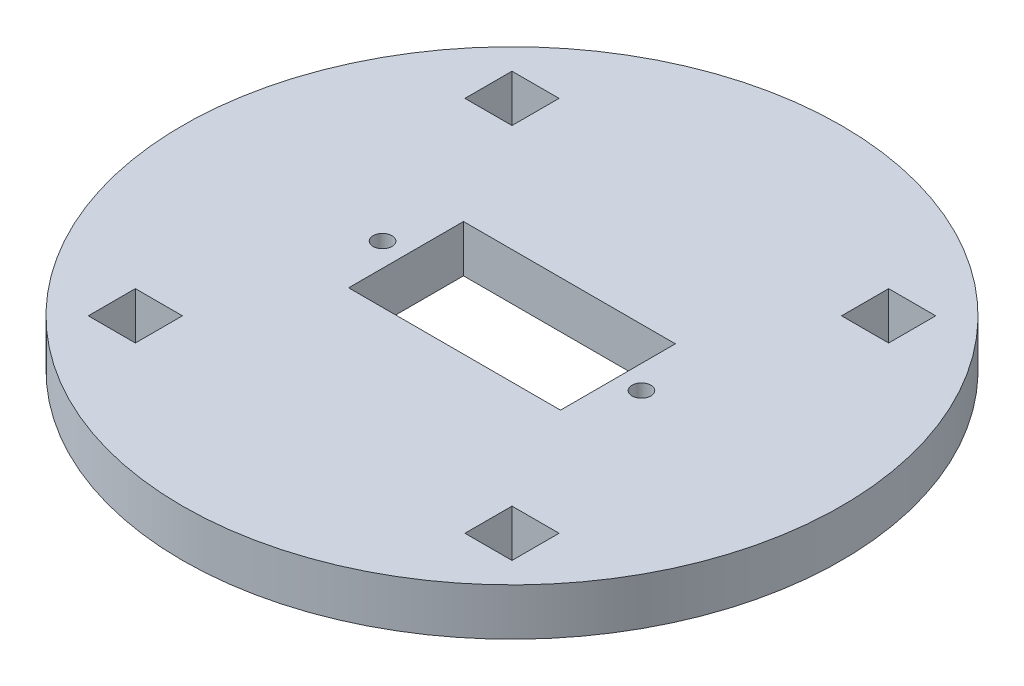
ISO-10303-21;
HEADER;
FILE_DESCRIPTION(('STEP AP214'),'2;1');
FILE_NAME('part.step','',(''),(''),'','','');
FILE_SCHEMA(('AUTOMOTIVE_DESIGN { 1 0 10303 214 1 1 1 1 }'));
ENDSEC;
DATA;
#1=APPLICATION_CONTEXT('core data for automotive mechanical design processes');
#2=APPLICATION_PROTOCOL_DEFINITION('international standard','automotive_design',2000,#1);
#3=PRODUCT_CONTEXT('',#1,'mechanical');
#4=PRODUCT('Part','Part','',(#3));
#5=PRODUCT_RELATED_PRODUCT_CATEGORY('part','',(#4));
#6=PRODUCT_DEFINITION_FORMATION('','',#4);
#7=PRODUCT_DEFINITION_CONTEXT('part definition',#1,'design');
#8=PRODUCT_DEFINITION('design','',#6,#7);
#9=PRODUCT_DEFINITION_SHAPE('','',#8);
#10=(LENGTH_UNIT() NAMED_UNIT(*) SI_UNIT(.MILLI.,.METRE.));
#11=(NAMED_UNIT(*) PLANE_ANGLE_UNIT() SI_UNIT($,.RADIAN.));
#12=(NAMED_UNIT(*) SI_UNIT($,.STERADIAN.) SOLID_ANGLE_UNIT());
#13=UNCERTAINTY_MEASURE_WITH_UNIT(LENGTH_MEASURE(1.E-05),#10,'distance_accuracy_value','');
#14=(GEOMETRIC_REPRESENTATION_CONTEXT(3) GLOBAL_UNCERTAINTY_ASSIGNED_CONTEXT((#13)) GLOBAL_UNIT_ASSIGNED_CONTEXT((#10,
#11,#12)) REPRESENTATION_CONTEXT('',''));
#15=CARTESIAN_POINT('',(0.,0.,0.));
#16=DIRECTION('',(0.,0.,1.));
#17=DIRECTION('',(1.,0.,0.));
#18=AXIS2_PLACEMENT_3D('',#15,#16,#17);
#19=CARTESIAN_POINT('',(0.,5.,0.));
#20=DIRECTION('',(0.,1.,0.));
#21=DIRECTION('',(0.,0.,1.));
#22=AXIS2_PLACEMENT_3D('',#19,#20,#21);
#23=PLANE('',#22);
#24=CARTESIAN_POINT('',(13.75,5.,0.));
#25=DIRECTION('',(0.,1.,0.));
#26=DIRECTION('',(0.,0.,1.));
#27=AXIS2_PLACEMENT_3D('',#24,#25,#26);
#28=CIRCLE('',#27,1.);
#29=CARTESIAN_POINT('',(13.75,5.,0.999999999999994));
#30=VERTEX_POINT('',#29);
#31=EDGE_CURVE('E311',#30,#30,#28,.T.);
#32=ORIENTED_EDGE('',*,*,#31,.F.);
#33=EDGE_LOOP('',(#32));
#34=FACE_BOUND('',#33,.T.);
#35=CARTESIAN_POINT('',(0.,5.,0.));
#36=DIRECTION('',(0.,1.,0.));
#37=DIRECTION('',(0.,0.,1.));
#38=AXIS2_PLACEMENT_3D('',#35,#36,#37);
#39=CIRCLE('',#38,35.);
#40=CARTESIAN_POINT('',(0.,5.,35.));
#41=VERTEX_POINT('',#40);
#42=EDGE_CURVE('E11',#41,#41,#39,.T.);
#43=ORIENTED_EDGE('',*,*,#42,.T.);
#44=EDGE_LOOP('',(#43));
#45=FACE_BOUND('',#44,.T.);
#46=DIRECTION('',(-1.,0.,0.));
#47=VECTOR('',#46,1.);
#48=CARTESIAN_POINT('',(-11.25,5.,-6.1));
#49=LINE('',#48,#47);
#50=CARTESIAN_POINT('',(11.25,5.,-6.1));
#51=VERTEX_POINT('',#50);
#52=CARTESIAN_POINT('',(-11.25,5.,-6.1));
#53=VERTEX_POINT('',#52);
#54=EDGE_CURVE('E319',#51,#53,#49,.T.);
#55=ORIENTED_EDGE('',*,*,#54,.F.);
#56=DIRECTION('',(0.,0.,-1.));
#57=VECTOR('',#56,1.);
#58=CARTESIAN_POINT('',(11.25,5.,6.1));
#59=LINE('',#58,#57);
#60=CARTESIAN_POINT('',(11.25,5.,6.1));
#61=VERTEX_POINT('',#60);
#62=EDGE_CURVE('E317',#61,#51,#59,.T.);
#63=ORIENTED_EDGE('',*,*,#62,.F.);
#64=DIRECTION('',(1.,0.,0.));
#65=VECTOR('',#64,1.);
#66=CARTESIAN_POINT('',(-11.25,5.,6.1));
#67=LINE('',#66,#65);
#68=CARTESIAN_POINT('',(-11.25,5.,6.1));
#69=VERTEX_POINT('',#68);
#70=EDGE_CURVE('E325',#69,#61,#67,.T.);
#71=ORIENTED_EDGE('',*,*,#70,.F.);
#72=DIRECTION('',(0.,0.,1.));
#73=VECTOR('',#72,1.);
#74=CARTESIAN_POINT('',(-11.25,5.,6.1));
#75=LINE('',#74,#73);
#76=EDGE_CURVE('E322',#53,#69,#75,.T.);
#77=ORIENTED_EDGE('',*,*,#76,.F.);
#78=EDGE_LOOP('',(#55,#63,#71,#77));
#79=FACE_BOUND('',#78,.T.);
#80=CARTESIAN_POINT('',(-13.75,5.,0.));
#81=DIRECTION('',(0.,1.,0.));
#82=DIRECTION('',(0.,0.,1.));
#83=AXIS2_PLACEMENT_3D('',#80,#81,#82);
#84=CIRCLE('',#83,1.);
#85=CARTESIAN_POINT('',(-13.75,5.,1.));
#86=VERTEX_POINT('',#85);
#87=EDGE_CURVE('E305',#86,#86,#84,.T.);
#88=ORIENTED_EDGE('',*,*,#87,.F.);
#89=EDGE_LOOP('',(#88));
#90=FACE_BOUND('',#89,.T.);
#91=DIRECTION('',(-1.,0.,0.));
#92=VECTOR('',#91,1.);
#93=CARTESIAN_POINT('',(-22.5,5.,17.5));
#94=LINE('',#93,#92);
#95=CARTESIAN_POINT('',(-17.5,5.,17.5));
#96=VERTEX_POINT('',#95);
#97=CARTESIAN_POINT('',(-22.5,5.,17.5));
#98=VERTEX_POINT('',#97);
#99=EDGE_CURVE('E276',#96,#98,#94,.T.);
#100=ORIENTED_EDGE('',*,*,#99,.F.);
#101=DIRECTION('',(0.,0.,-1.));
#102=VECTOR('',#101,1.);
#103=CARTESIAN_POINT('',(-17.5,5.,17.5));
#104=LINE('',#103,#102);
#105=CARTESIAN_POINT('',(-17.5,5.,22.5));
#106=VERTEX_POINT('',#105);
#107=EDGE_CURVE('E274',#106,#96,#104,.T.);
#108=ORIENTED_EDGE('',*,*,#107,.F.);
#109=DIRECTION('',(1.,0.,0.));
#110=VECTOR('',#109,1.);
#111=CARTESIAN_POINT('',(-22.5,5.,22.5));
#112=LINE('',#111,#110);
#113=CARTESIAN_POINT('',(-22.5,5.,22.5));
#114=VERTEX_POINT('',#113);
#115=EDGE_CURVE('E282',#114,#106,#112,.T.);
#116=ORIENTED_EDGE('',*,*,#115,.F.);
#117=DIRECTION('',(0.,0.,1.));
#118=VECTOR('',#117,1.);
#119=CARTESIAN_POINT('',(-22.5,5.,17.5));
#120=LINE('',#119,#118);
#121=EDGE_CURVE('E279',#98,#114,#120,.T.);
#122=ORIENTED_EDGE('',*,*,#121,.F.);
#123=EDGE_LOOP('',(#100,#108,#116,#122));
#124=FACE_BOUND('',#123,.T.);
#125=DIRECTION('',(1.,0.,0.));
#126=VECTOR('',#125,1.);
#127=CARTESIAN_POINT('',(-17.4999999999999,5.,-17.5000000000001));
#128=LINE('',#127,#126);
#129=CARTESIAN_POINT('',(-22.4999999999999,5.,-17.5000000000001));
#130=VERTEX_POINT('',#129);
#131=CARTESIAN_POINT('',(-17.4999999999999,5.,-17.5000000000001));
#132=VERTEX_POINT('',#131);
#133=EDGE_CURVE('E245',#130,#132,#128,.T.);
#134=ORIENTED_EDGE('',*,*,#133,.F.);
#135=DIRECTION('',(0.,0.,1.));
#136=VECTOR('',#135,1.);
#137=CARTESIAN_POINT('',(-22.4999999999999,5.,-22.5000000000001));
#138=LINE('',#137,#136);
#139=CARTESIAN_POINT('',(-22.4999999999999,5.,-22.5000000000001));
#140=VERTEX_POINT('',#139);
#141=EDGE_CURVE('E243',#140,#130,#138,.T.);
#142=ORIENTED_EDGE('',*,*,#141,.F.);
#143=DIRECTION('',(-1.,0.,0.));
#144=VECTOR('',#143,1.);
#145=CARTESIAN_POINT('',(-17.4999999999999,5.,-22.5000000000001));
#146=LINE('',#145,#144);
#147=CARTESIAN_POINT('',(-17.4999999999999,5.,-22.5000000000001));
#148=VERTEX_POINT('',#147);
#149=EDGE_CURVE('E251',#148,#140,#146,.T.);
#150=ORIENTED_EDGE('',*,*,#149,.F.);
#151=DIRECTION('',(0.,0.,-1.));
#152=VECTOR('',#151,1.);
#153=CARTESIAN_POINT('',(-17.4999999999999,5.,-22.5000000000001));
#154=LINE('',#153,#152);
#155=EDGE_CURVE('E248',#132,#148,#154,.T.);
#156=ORIENTED_EDGE('',*,*,#155,.F.);
#157=EDGE_LOOP('',(#134,#142,#150,#156));
#158=FACE_BOUND('',#157,.T.);
#159=DIRECTION('',(0.,0.,1.));
#160=VECTOR('',#159,1.);
#161=CARTESIAN_POINT('',(17.5000000000001,5.,-17.4999999999999));
#162=LINE('',#161,#160);
#163=CARTESIAN_POINT('',(17.5000000000001,5.,-22.4999999999999));
#164=VERTEX_POINT('',#163);
#165=CARTESIAN_POINT('',(17.5000000000001,5.,-17.4999999999999));
#166=VERTEX_POINT('',#165);
#167=EDGE_CURVE('E214',#164,#166,#162,.T.);
#168=ORIENTED_EDGE('',*,*,#167,.F.);
#169=DIRECTION('',(-1.,0.,0.));
#170=VECTOR('',#169,1.);
#171=CARTESIAN_POINT('',(22.5000000000002,5.,-22.4999999999999));
#172=LINE('',#171,#170);
#173=CARTESIAN_POINT('',(22.5000000000002,5.,-22.4999999999999));
#174=VERTEX_POINT('',#173);
#175=EDGE_CURVE('E212',#174,#164,#172,.T.);
#176=ORIENTED_EDGE('',*,*,#175,.F.);
#177=DIRECTION('',(0.,0.,-1.));
#178=VECTOR('',#177,1.);
#179=CARTESIAN_POINT('',(22.5000000000001,5.,-17.4999999999999));
#180=LINE('',#179,#178);
#181=CARTESIAN_POINT('',(22.5000000000001,5.,-17.4999999999999));
#182=VERTEX_POINT('',#181);
#183=EDGE_CURVE('E220',#182,#174,#180,.T.);
#184=ORIENTED_EDGE('',*,*,#183,.F.);
#185=DIRECTION('',(1.,0.,0.));
#186=VECTOR('',#185,1.);
#187=CARTESIAN_POINT('',(22.5000000000001,5.,-17.4999999999999));
#188=LINE('',#187,#186);
#189=EDGE_CURVE('E217',#166,#182,#188,.T.);
#190=ORIENTED_EDGE('',*,*,#189,.F.);
#191=EDGE_LOOP('',(#168,#176,#184,#190));
#192=FACE_BOUND('',#191,.T.);
#193=DIRECTION('',(-1.,0.,0.));
#194=VECTOR('',#193,1.);
#195=CARTESIAN_POINT('',(17.4999999999998,5.,17.5000000000002));
#196=LINE('',#195,#194);
#197=CARTESIAN_POINT('',(22.4999999999998,5.,17.5000000000002));
#198=VERTEX_POINT('',#197);
#199=CARTESIAN_POINT('',(17.4999999999998,5.,17.5000000000002));
#200=VERTEX_POINT('',#199);
#201=EDGE_CURVE('E184',#198,#200,#196,.T.);
#202=ORIENTED_EDGE('',*,*,#201,.F.);
#203=DIRECTION('',(0.,0.,-1.));
#204=VECTOR('',#203,1.);
#205=CARTESIAN_POINT('',(22.4999999999998,5.,22.5000000000002));
#206=LINE('',#205,#204);
#207=CARTESIAN_POINT('',(22.4999999999998,5.,22.5000000000002));
#208=VERTEX_POINT('',#207);
#209=EDGE_CURVE('E176',#208,#198,#206,.T.);
#210=ORIENTED_EDGE('',*,*,#209,.F.);
#211=DIRECTION('',(1.,0.,0.));
#212=VECTOR('',#211,1.);
#213=CARTESIAN_POINT('',(17.4999999999998,5.,22.5000000000002));
#214=LINE('',#213,#212);
#215=CARTESIAN_POINT('',(17.4999999999998,5.,22.5000000000002));
#216=VERTEX_POINT('',#215);
#217=EDGE_CURVE('E198',#216,#208,#214,.T.);
#218=ORIENTED_EDGE('',*,*,#217,.F.);
#219=DIRECTION('',(0.,0.,1.));
#220=VECTOR('',#219,1.);
#221=CARTESIAN_POINT('',(17.4999999999998,5.,22.5000000000002));
#222=LINE('',#221,#220);
#223=EDGE_CURVE('E196',#200,#216,#222,.T.);
#224=ORIENTED_EDGE('',*,*,#223,.F.);
#225=EDGE_LOOP('',(#202,#210,#218,#224));
#226=FACE_BOUND('',#225,.T.);
#227=ADVANCED_FACE('F39',(#34,#45,#79,#90,#124,#158,#192,#226),#23,.T.);
#228=CARTESIAN_POINT('',(0.,0.,0.));
#229=DIRECTION('',(0.,1.,0.));
#230=DIRECTION('',(0.,0.,1.));
#231=AXIS2_PLACEMENT_3D('',#228,#229,#230);
#232=PLANE('',#231);
#233=DIRECTION('',(-1.,0.,0.));
#234=VECTOR('',#233,1.);
#235=CARTESIAN_POINT('',(22.5000000000002,0.,-22.4999999999999));
#236=LINE('',#235,#234);
#237=CARTESIAN_POINT('',(22.5000000000002,0.,-22.4999999999999));
#238=VERTEX_POINT('',#237);
#239=CARTESIAN_POINT('',(17.5000000000001,0.,-22.4999999999999));
#240=VERTEX_POINT('',#239);
#241=EDGE_CURVE('E192',#238,#240,#236,.T.);
#242=ORIENTED_EDGE('',*,*,#241,.T.);
#243=DIRECTION('',(0.,0.,1.));
#244=VECTOR('',#243,1.);
#245=CARTESIAN_POINT('',(17.5000000000001,0.,-17.4999999999999));
#246=LINE('',#245,#244);
#247=CARTESIAN_POINT('',(17.5000000000001,0.,-17.4999999999999));
#248=VERTEX_POINT('',#247);
#249=EDGE_CURVE('E225',#240,#248,#246,.T.);
#250=ORIENTED_EDGE('',*,*,#249,.T.);
#251=DIRECTION('',(1.,0.,0.));
#252=VECTOR('',#251,1.);
#253=CARTESIAN_POINT('',(22.5000000000001,0.,-17.4999999999999));
#254=LINE('',#253,#252);
#255=CARTESIAN_POINT('',(22.5000000000001,0.,-17.4999999999999));
#256=VERTEX_POINT('',#255);
#257=EDGE_CURVE('E228',#248,#256,#254,.T.);
#258=ORIENTED_EDGE('',*,*,#257,.T.);
#259=DIRECTION('',(0.,0.,-1.));
#260=VECTOR('',#259,1.);
#261=CARTESIAN_POINT('',(22.5000000000001,0.,-17.4999999999999));
#262=LINE('',#261,#260);
#263=EDGE_CURVE('E215',#256,#238,#262,.T.);
#264=ORIENTED_EDGE('',*,*,#263,.T.);
#265=EDGE_LOOP('',(#242,#250,#258,#264));
#266=FACE_BOUND('',#265,.T.);
#267=DIRECTION('',(0.,0.,-1.));
#268=VECTOR('',#267,1.);
#269=CARTESIAN_POINT('',(-17.5,0.,17.5));
#270=LINE('',#269,#268);
#271=CARTESIAN_POINT('',(-17.5,0.,22.5));
#272=VERTEX_POINT('',#271);
#273=CARTESIAN_POINT('',(-17.5,0.,17.5));
#274=VERTEX_POINT('',#273);
#275=EDGE_CURVE('E273',#272,#274,#270,.T.);
#276=ORIENTED_EDGE('',*,*,#275,.T.);
#277=DIRECTION('',(-1.,0.,0.));
#278=VECTOR('',#277,1.);
#279=CARTESIAN_POINT('',(-22.5,0.,17.5));
#280=LINE('',#279,#278);
#281=CARTESIAN_POINT('',(-22.5,0.,17.5));
#282=VERTEX_POINT('',#281);
#283=EDGE_CURVE('E287',#274,#282,#280,.T.);
#284=ORIENTED_EDGE('',*,*,#283,.T.);
#285=DIRECTION('',(0.,0.,1.));
#286=VECTOR('',#285,1.);
#287=CARTESIAN_POINT('',(-22.5,0.,17.5));
#288=LINE('',#287,#286);
#289=CARTESIAN_POINT('',(-22.5,0.,22.5));
#290=VERTEX_POINT('',#289);
#291=EDGE_CURVE('E290',#282,#290,#288,.T.);
#292=ORIENTED_EDGE('',*,*,#291,.T.);
#293=DIRECTION('',(1.,0.,0.));
#294=VECTOR('',#293,1.);
#295=CARTESIAN_POINT('',(-22.5,0.,22.5));
#296=LINE('',#295,#294);
#297=EDGE_CURVE('E277',#290,#272,#296,.T.);
#298=ORIENTED_EDGE('',*,*,#297,.T.);
#299=EDGE_LOOP('',(#276,#284,#292,#298));
#300=FACE_BOUND('',#299,.T.);
#301=CARTESIAN_POINT('',(0.,0.,0.));
#302=DIRECTION('',(0.,1.,0.));
#303=DIRECTION('',(0.,0.,1.));
#304=AXIS2_PLACEMENT_3D('',#301,#302,#303);
#305=CIRCLE('',#304,35.);
#306=CARTESIAN_POINT('',(0.,0.,35.));
#307=VERTEX_POINT('',#306);
#308=EDGE_CURVE('E43',#307,#307,#305,.T.);
#309=ORIENTED_EDGE('',*,*,#308,.F.);
#310=EDGE_LOOP('',(#309));
#311=FACE_BOUND('',#310,.T.);
#312=DIRECTION('',(0.,0.,-1.));
#313=VECTOR('',#312,1.);
#314=CARTESIAN_POINT('',(11.25,0.,6.1));
#315=LINE('',#314,#313);
#316=CARTESIAN_POINT('',(11.25,0.,6.1));
#317=VERTEX_POINT('',#316);
#318=CARTESIAN_POINT('',(11.25,0.,-6.1));
#319=VERTEX_POINT('',#318);
#320=EDGE_CURVE('E314',#317,#319,#315,.T.);
#321=ORIENTED_EDGE('',*,*,#320,.T.);
#322=DIRECTION('',(-1.,0.,0.));
#323=VECTOR('',#322,1.);
#324=CARTESIAN_POINT('',(-11.25,0.,-6.1));
#325=LINE('',#324,#323);
#326=CARTESIAN_POINT('',(-11.25,0.,-6.1));
#327=VERTEX_POINT('',#326);
#328=EDGE_CURVE('E330',#319,#327,#325,.T.);
#329=ORIENTED_EDGE('',*,*,#328,.T.);
#330=DIRECTION('',(0.,0.,1.));
#331=VECTOR('',#330,1.);
#332=CARTESIAN_POINT('',(-11.25,0.,6.1));
#333=LINE('',#332,#331);
#334=CARTESIAN_POINT('',(-11.25,0.,6.1));
#335=VERTEX_POINT('',#334);
#336=EDGE_CURVE('E333',#327,#335,#333,.T.);
#337=ORIENTED_EDGE('',*,*,#336,.T.);
#338=DIRECTION('',(1.,0.,0.));
#339=VECTOR('',#338,1.);
#340=CARTESIAN_POINT('',(-11.25,0.,6.1));
#341=LINE('',#340,#339);
#342=EDGE_CURVE('E320',#335,#317,#341,.T.);
#343=ORIENTED_EDGE('',*,*,#342,.T.);
#344=EDGE_LOOP('',(#321,#329,#337,#343));
#345=FACE_BOUND('',#344,.T.);
#346=CARTESIAN_POINT('',(13.75,0.,0.));
#347=DIRECTION('',(0.,1.,0.));
#348=DIRECTION('',(0.,0.,1.));
#349=AXIS2_PLACEMENT_3D('',#346,#347,#348);
#350=CIRCLE('',#349,1.);
#351=CARTESIAN_POINT('',(13.75,0.,0.999999999999994));
#352=VERTEX_POINT('',#351);
#353=EDGE_CURVE('E308',#352,#352,#350,.T.);
#354=ORIENTED_EDGE('',*,*,#353,.T.);
#355=EDGE_LOOP('',(#354));
#356=FACE_BOUND('',#355,.T.);
#357=CARTESIAN_POINT('',(-13.75,0.,0.));
#358=DIRECTION('',(0.,1.,0.));
#359=DIRECTION('',(0.,0.,1.));
#360=AXIS2_PLACEMENT_3D('',#357,#358,#359);
#361=CIRCLE('',#360,1.);
#362=CARTESIAN_POINT('',(-13.75,0.,1.));
#363=VERTEX_POINT('',#362);
#364=EDGE_CURVE('E304',#363,#363,#361,.T.);
#365=ORIENTED_EDGE('',*,*,#364,.T.);
#366=EDGE_LOOP('',(#365));
#367=FACE_BOUND('',#366,.T.);
#368=DIRECTION('',(0.,0.,1.));
#369=VECTOR('',#368,1.);
#370=CARTESIAN_POINT('',(-22.4999999999999,0.,-22.5000000000001));
#371=LINE('',#370,#369);
#372=CARTESIAN_POINT('',(-22.4999999999999,0.,-22.5000000000001));
#373=VERTEX_POINT('',#372);
#374=CARTESIAN_POINT('',(-22.4999999999999,0.,-17.5000000000001));
#375=VERTEX_POINT('',#374);
#376=EDGE_CURVE('E242',#373,#375,#371,.T.);
#377=ORIENTED_EDGE('',*,*,#376,.T.);
#378=DIRECTION('',(1.,0.,0.));
#379=VECTOR('',#378,1.);
#380=CARTESIAN_POINT('',(-17.4999999999999,0.,-17.5000000000001));
#381=LINE('',#380,#379);
#382=CARTESIAN_POINT('',(-17.4999999999999,0.,-17.5000000000001));
#383=VERTEX_POINT('',#382);
#384=EDGE_CURVE('E256',#375,#383,#381,.T.);
#385=ORIENTED_EDGE('',*,*,#384,.T.);
#386=DIRECTION('',(0.,0.,-1.));
#387=VECTOR('',#386,1.);
#388=CARTESIAN_POINT('',(-17.4999999999999,0.,-22.5000000000001));
#389=LINE('',#388,#387);
#390=CARTESIAN_POINT('',(-17.4999999999999,0.,-22.5000000000001));
#391=VERTEX_POINT('',#390);
#392=EDGE_CURVE('E259',#383,#391,#389,.T.);
#393=ORIENTED_EDGE('',*,*,#392,.T.);
#394=DIRECTION('',(-1.,0.,0.));
#395=VECTOR('',#394,1.);
#396=CARTESIAN_POINT('',(-17.4999999999999,0.,-22.5000000000001));
#397=LINE('',#396,#395);
#398=EDGE_CURVE('E246',#391,#373,#397,.T.);
#399=ORIENTED_EDGE('',*,*,#398,.T.);
#400=EDGE_LOOP('',(#377,#385,#393,#399));
#401=FACE_BOUND('',#400,.T.);
#402=DIRECTION('',(0.,0.,-1.));
#403=VECTOR('',#402,1.);
#404=CARTESIAN_POINT('',(22.4999999999998,0.,22.5000000000002));
#405=LINE('',#404,#403);
#406=CARTESIAN_POINT('',(22.4999999999998,0.,22.5000000000002));
#407=VERTEX_POINT('',#406);
#408=CARTESIAN_POINT('',(22.4999999999998,0.,17.5000000000002));
#409=VERTEX_POINT('',#408);
#410=EDGE_CURVE('E62',#407,#409,#405,.T.);
#411=ORIENTED_EDGE('',*,*,#410,.T.);
#412=DIRECTION('',(-1.,0.,0.));
#413=VECTOR('',#412,1.);
#414=CARTESIAN_POINT('',(17.4999999999998,0.,17.5000000000002));
#415=LINE('',#414,#413);
#416=CARTESIAN_POINT('',(17.4999999999998,0.,17.5000000000002));
#417=VERTEX_POINT('',#416);
#418=EDGE_CURVE('E191',#409,#417,#415,.T.);
#419=ORIENTED_EDGE('',*,*,#418,.T.);
#420=DIRECTION('',(0.,0.,1.));
#421=VECTOR('',#420,1.);
#422=CARTESIAN_POINT('',(17.4999999999998,0.,22.5000000000002));
#423=LINE('',#422,#421);
#424=CARTESIAN_POINT('',(17.4999999999998,0.,22.5000000000002));
#425=VERTEX_POINT('',#424);
#426=EDGE_CURVE('E204',#417,#425,#423,.T.);
#427=ORIENTED_EDGE('',*,*,#426,.T.);
#428=DIRECTION('',(1.,0.,0.));
#429=VECTOR('',#428,1.);
#430=CARTESIAN_POINT('',(17.4999999999998,0.,22.5000000000002));
#431=LINE('',#430,#429);
#432=EDGE_CURVE('E185',#425,#407,#431,.T.);
#433=ORIENTED_EDGE('',*,*,#432,.T.);
#434=EDGE_LOOP('',(#411,#419,#427,#433));
#435=FACE_BOUND('',#434,.T.);
#436=ADVANCED_FACE('F352',(#266,#300,#311,#345,#356,#367,#401,#435),#232,.F.);
#437=CARTESIAN_POINT('',(0.,5.,0.));
#438=DIRECTION('',(0.,-1.,0.));
#439=DIRECTION('',(0.,0.,-1.));
#440=AXIS2_PLACEMENT_3D('',#437,#438,#439);
#441=CYLINDRICAL_SURFACE('',#440,35.);
#442=ORIENTED_EDGE('',*,*,#42,.F.);
#443=EDGE_LOOP('',(#442));
#444=FACE_BOUND('',#443,.T.);
#445=ORIENTED_EDGE('',*,*,#308,.T.);
#446=EDGE_LOOP('',(#445));
#447=FACE_BOUND('',#446,.T.);
#448=ADVANCED_FACE('F41',(#444,#447),#441,.T.);
#449=CARTESIAN_POINT('',(11.25,5.,6.1));
#450=DIRECTION('',(-1.,0.,0.));
#451=DIRECTION('',(0.,0.,1.));
#452=AXIS2_PLACEMENT_3D('',#449,#450,#451);
#453=PLANE('',#452);
#454=ORIENTED_EDGE('',*,*,#320,.F.);
#455=DIRECTION('',(0.,-1.,0.));
#456=VECTOR('',#455,1.);
#457=CARTESIAN_POINT('',(11.25,5.,6.1));
#458=LINE('',#457,#456);
#459=EDGE_CURVE('E327',#61,#317,#458,.T.);
#460=ORIENTED_EDGE('',*,*,#459,.F.);
#461=ORIENTED_EDGE('',*,*,#62,.T.);
#462=DIRECTION('',(0.,-1.,0.));
#463=VECTOR('',#462,1.);
#464=CARTESIAN_POINT('',(11.25,5.,-6.1));
#465=LINE('',#464,#463);
#466=EDGE_CURVE('E344',#51,#319,#465,.T.);
#467=ORIENTED_EDGE('',*,*,#466,.T.);
#468=EDGE_LOOP('',(#454,#460,#461,#467));
#469=FACE_BOUND('',#468,.T.);
#470=ADVANCED_FACE('F380',(#469),#453,.T.);
#471=CARTESIAN_POINT('',(-11.25,5.,-6.1));
#472=DIRECTION('',(0.,0.,1.));
#473=DIRECTION('',(1.,0.,0.));
#474=AXIS2_PLACEMENT_3D('',#471,#472,#473);
#475=PLANE('',#474);
#476=ORIENTED_EDGE('',*,*,#328,.F.);
#477=ORIENTED_EDGE('',*,*,#466,.F.);
#478=ORIENTED_EDGE('',*,*,#54,.T.);
#479=DIRECTION('',(0.,-1.,0.));
#480=VECTOR('',#479,1.);
#481=CARTESIAN_POINT('',(-11.25,5.,-6.1));
#482=LINE('',#481,#480);
#483=EDGE_CURVE('E342',#53,#327,#482,.T.);
#484=ORIENTED_EDGE('',*,*,#483,.T.);
#485=EDGE_LOOP('',(#476,#477,#478,#484));
#486=FACE_BOUND('',#485,.T.);
#487=ADVANCED_FACE('F383',(#486),#475,.T.);
#488=CARTESIAN_POINT('',(-11.25,5.,6.1));
#489=DIRECTION('',(1.,0.,0.));
#490=DIRECTION('',(0.,0.,-1.));
#491=AXIS2_PLACEMENT_3D('',#488,#489,#490);
#492=PLANE('',#491);
#493=ORIENTED_EDGE('',*,*,#336,.F.);
#494=ORIENTED_EDGE('',*,*,#483,.F.);
#495=ORIENTED_EDGE('',*,*,#76,.T.);
#496=DIRECTION('',(0.,-1.,0.));
#497=VECTOR('',#496,1.);
#498=CARTESIAN_POINT('',(-11.25,5.,6.1));
#499=LINE('',#498,#497);
#500=EDGE_CURVE('E340',#69,#335,#499,.T.);
#501=ORIENTED_EDGE('',*,*,#500,.T.);
#502=EDGE_LOOP('',(#493,#494,#495,#501));
#503=FACE_BOUND('',#502,.T.);
#504=ADVANCED_FACE('F386',(#503),#492,.T.);
#505=CARTESIAN_POINT('',(-11.25,5.,6.1));
#506=DIRECTION('',(0.,0.,-1.));
#507=DIRECTION('',(-1.,0.,0.));
#508=AXIS2_PLACEMENT_3D('',#505,#506,#507);
#509=PLANE('',#508);
#510=ORIENTED_EDGE('',*,*,#342,.F.);
#511=ORIENTED_EDGE('',*,*,#500,.F.);
#512=ORIENTED_EDGE('',*,*,#70,.T.);
#513=ORIENTED_EDGE('',*,*,#459,.T.);
#514=EDGE_LOOP('',(#510,#511,#512,#513));
#515=FACE_BOUND('',#514,.T.);
#516=ADVANCED_FACE('F390',(#515),#509,.T.);
#517=CARTESIAN_POINT('',(13.75,5.,0.));
#518=DIRECTION('',(0.,-1.,0.));
#519=DIRECTION('',(0.,0.,-1.));
#520=AXIS2_PLACEMENT_3D('',#517,#518,#519);
#521=CYLINDRICAL_SURFACE('',#520,1.);
#522=ORIENTED_EDGE('',*,*,#31,.T.);
#523=EDGE_LOOP('',(#522));
#524=FACE_BOUND('',#523,.T.);
#525=ORIENTED_EDGE('',*,*,#353,.F.);
#526=EDGE_LOOP('',(#525));
#527=FACE_BOUND('',#526,.T.);
#528=ADVANCED_FACE('F394',(#524,#527),#521,.F.);
#529=CARTESIAN_POINT('',(-13.75,5.,0.));
#530=DIRECTION('',(0.,-1.,0.));
#531=DIRECTION('',(0.,0.,-1.));
#532=AXIS2_PLACEMENT_3D('',#529,#530,#531);
#533=CYLINDRICAL_SURFACE('',#532,1.);
#534=ORIENTED_EDGE('',*,*,#87,.T.);
#535=EDGE_LOOP('',(#534));
#536=FACE_BOUND('',#535,.T.);
#537=ORIENTED_EDGE('',*,*,#364,.F.);
#538=EDGE_LOOP('',(#537));
#539=FACE_BOUND('',#538,.T.);
#540=ADVANCED_FACE('F398',(#536,#539),#533,.F.);
#541=CARTESIAN_POINT('',(-17.5,5.,17.5));
#542=DIRECTION('',(-1.,0.,0.));
#543=DIRECTION('',(0.,0.,1.));
#544=AXIS2_PLACEMENT_3D('',#541,#542,#543);
#545=PLANE('',#544);
#546=ORIENTED_EDGE('',*,*,#275,.F.);
#547=DIRECTION('',(0.,-1.,0.));
#548=VECTOR('',#547,1.);
#549=CARTESIAN_POINT('',(-17.5,5.,22.5));
#550=LINE('',#549,#548);
#551=EDGE_CURVE('E284',#106,#272,#550,.T.);
#552=ORIENTED_EDGE('',*,*,#551,.F.);
#553=ORIENTED_EDGE('',*,*,#107,.T.);
#554=DIRECTION('',(0.,-1.,0.));
#555=VECTOR('',#554,1.);
#556=CARTESIAN_POINT('',(-17.5,5.,17.5));
#557=LINE('',#556,#555);
#558=EDGE_CURVE('E301',#96,#274,#557,.T.);
#559=ORIENTED_EDGE('',*,*,#558,.T.);
#560=EDGE_LOOP('',(#546,#552,#553,#559));
#561=FACE_BOUND('',#560,.T.);
#562=ADVANCED_FACE('F402',(#561),#545,.T.);
#563=CARTESIAN_POINT('',(-22.5,5.,17.5));
#564=DIRECTION('',(0.,0.,1.));
#565=DIRECTION('',(1.,0.,0.));
#566=AXIS2_PLACEMENT_3D('',#563,#564,#565);
#567=PLANE('',#566);
#568=ORIENTED_EDGE('',*,*,#283,.F.);
#569=ORIENTED_EDGE('',*,*,#558,.F.);
#570=ORIENTED_EDGE('',*,*,#99,.T.);
#571=DIRECTION('',(0.,-1.,0.));
#572=VECTOR('',#571,1.);
#573=CARTESIAN_POINT('',(-22.5,5.,17.5));
#574=LINE('',#573,#572);
#575=EDGE_CURVE('E299',#98,#282,#574,.T.);
#576=ORIENTED_EDGE('',*,*,#575,.T.);
#577=EDGE_LOOP('',(#568,#569,#570,#576));
#578=FACE_BOUND('',#577,.T.);
#579=ADVANCED_FACE('F406',(#578),#567,.T.);
#580=CARTESIAN_POINT('',(-22.5,5.,17.5));
#581=DIRECTION('',(1.,0.,0.));
#582=DIRECTION('',(0.,0.,-1.));
#583=AXIS2_PLACEMENT_3D('',#580,#581,#582);
#584=PLANE('',#583);
#585=ORIENTED_EDGE('',*,*,#291,.F.);
#586=ORIENTED_EDGE('',*,*,#575,.F.);
#587=ORIENTED_EDGE('',*,*,#121,.T.);
#588=DIRECTION('',(0.,-1.,0.));
#589=VECTOR('',#588,1.);
#590=CARTESIAN_POINT('',(-22.5,5.,22.5));
#591=LINE('',#590,#589);
#592=EDGE_CURVE('E297',#114,#290,#591,.T.);
#593=ORIENTED_EDGE('',*,*,#592,.T.);
#594=EDGE_LOOP('',(#585,#586,#587,#593));
#595=FACE_BOUND('',#594,.T.);
#596=ADVANCED_FACE('F410',(#595),#584,.T.);
#597=CARTESIAN_POINT('',(-22.5,5.,22.5));
#598=DIRECTION('',(0.,0.,-1.));
#599=DIRECTION('',(-1.,0.,0.));
#600=AXIS2_PLACEMENT_3D('',#597,#598,#599);
#601=PLANE('',#600);
#602=ORIENTED_EDGE('',*,*,#297,.F.);
#603=ORIENTED_EDGE('',*,*,#592,.F.);
#604=ORIENTED_EDGE('',*,*,#115,.T.);
#605=ORIENTED_EDGE('',*,*,#551,.T.);
#606=EDGE_LOOP('',(#602,#603,#604,#605));
#607=FACE_BOUND('',#606,.T.);
#608=ADVANCED_FACE('F414',(#607),#601,.T.);
#609=CARTESIAN_POINT('',(-22.4999999999999,5.,-22.5000000000001));
#610=DIRECTION('',(1.,0.,0.));
#611=DIRECTION('',(0.,0.,-1.));
#612=AXIS2_PLACEMENT_3D('',#609,#610,#611);
#613=PLANE('',#612);
#614=ORIENTED_EDGE('',*,*,#376,.F.);
#615=DIRECTION('',(0.,-1.,0.));
#616=VECTOR('',#615,1.);
#617=CARTESIAN_POINT('',(-22.4999999999999,5.,-22.5000000000001));
#618=LINE('',#617,#616);
#619=EDGE_CURVE('E253',#140,#373,#618,.T.);
#620=ORIENTED_EDGE('',*,*,#619,.F.);
#621=ORIENTED_EDGE('',*,*,#141,.T.);
#622=DIRECTION('',(0.,-1.,0.));
#623=VECTOR('',#622,1.);
#624=CARTESIAN_POINT('',(-22.4999999999999,5.,-17.5000000000001));
#625=LINE('',#624,#623);
#626=EDGE_CURVE('E270',#130,#375,#625,.T.);
#627=ORIENTED_EDGE('',*,*,#626,.T.);
#628=EDGE_LOOP('',(#614,#620,#621,#627));
#629=FACE_BOUND('',#628,.T.);
#630=ADVANCED_FACE('F418',(#629),#613,.T.);
#631=CARTESIAN_POINT('',(-17.4999999999999,5.,-17.5000000000001));
#632=DIRECTION('',(0.,0.,-1.));
#633=DIRECTION('',(-1.,0.,0.));
#634=AXIS2_PLACEMENT_3D('',#631,#632,#633);
#635=PLANE('',#634);
#636=ORIENTED_EDGE('',*,*,#384,.F.);
#637=ORIENTED_EDGE('',*,*,#626,.F.);
#638=ORIENTED_EDGE('',*,*,#133,.T.);
#639=DIRECTION('',(0.,-1.,0.));
#640=VECTOR('',#639,1.);
#641=CARTESIAN_POINT('',(-17.4999999999999,5.,-17.5000000000001));
#642=LINE('',#641,#640);
#643=EDGE_CURVE('E268',#132,#383,#642,.T.);
#644=ORIENTED_EDGE('',*,*,#643,.T.);
#645=EDGE_LOOP('',(#636,#637,#638,#644));
#646=FACE_BOUND('',#645,.T.);
#647=ADVANCED_FACE('F422',(#646),#635,.T.);
#648=CARTESIAN_POINT('',(-17.4999999999999,5.,-22.5000000000001));
#649=DIRECTION('',(-1.,0.,0.));
#650=DIRECTION('',(0.,0.,1.));
#651=AXIS2_PLACEMENT_3D('',#648,#649,#650);
#652=PLANE('',#651);
#653=ORIENTED_EDGE('',*,*,#392,.F.);
#654=ORIENTED_EDGE('',*,*,#643,.F.);
#655=ORIENTED_EDGE('',*,*,#155,.T.);
#656=DIRECTION('',(0.,-1.,0.));
#657=VECTOR('',#656,1.);
#658=CARTESIAN_POINT('',(-17.4999999999999,5.,-22.5000000000001));
#659=LINE('',#658,#657);
#660=EDGE_CURVE('E266',#148,#391,#659,.T.);
#661=ORIENTED_EDGE('',*,*,#660,.T.);
#662=EDGE_LOOP('',(#653,#654,#655,#661));
#663=FACE_BOUND('',#662,.T.);
#664=ADVANCED_FACE('F426',(#663),#652,.T.);
#665=CARTESIAN_POINT('',(-17.4999999999999,5.,-22.5000000000001));
#666=DIRECTION('',(0.,0.,1.));
#667=DIRECTION('',(1.,0.,0.));
#668=AXIS2_PLACEMENT_3D('',#665,#666,#667);
#669=PLANE('',#668);
#670=ORIENTED_EDGE('',*,*,#398,.F.);
#671=ORIENTED_EDGE('',*,*,#660,.F.);
#672=ORIENTED_EDGE('',*,*,#149,.T.);
#673=ORIENTED_EDGE('',*,*,#619,.T.);
#674=EDGE_LOOP('',(#670,#671,#672,#673));
#675=FACE_BOUND('',#674,.T.);
#676=ADVANCED_FACE('F430',(#675),#669,.T.);
#677=CARTESIAN_POINT('',(22.5000000000002,5.,-22.4999999999999));
#678=DIRECTION('',(0.,0.,1.));
#679=DIRECTION('',(1.,0.,0.));
#680=AXIS2_PLACEMENT_3D('',#677,#678,#679);
#681=PLANE('',#680);
#682=ORIENTED_EDGE('',*,*,#241,.F.);
#683=DIRECTION('',(0.,-1.,0.));
#684=VECTOR('',#683,1.);
#685=CARTESIAN_POINT('',(22.5000000000002,5.,-22.4999999999999));
#686=LINE('',#685,#684);
#687=EDGE_CURVE('E222',#174,#238,#686,.T.);
#688=ORIENTED_EDGE('',*,*,#687,.F.);
#689=ORIENTED_EDGE('',*,*,#175,.T.);
#690=DIRECTION('',(0.,-1.,0.));
#691=VECTOR('',#690,1.);
#692=CARTESIAN_POINT('',(17.5000000000001,5.,-22.4999999999999));
#693=LINE('',#692,#691);
#694=EDGE_CURVE('E239',#164,#240,#693,.T.);
#695=ORIENTED_EDGE('',*,*,#694,.T.);
#696=EDGE_LOOP('',(#682,#688,#689,#695));
#697=FACE_BOUND('',#696,.T.);
#698=ADVANCED_FACE('F434',(#697),#681,.T.);
#699=CARTESIAN_POINT('',(17.5000000000001,5.,-17.4999999999999));
#700=DIRECTION('',(1.,0.,0.));
#701=DIRECTION('',(0.,0.,-1.));
#702=AXIS2_PLACEMENT_3D('',#699,#700,#701);
#703=PLANE('',#702);
#704=ORIENTED_EDGE('',*,*,#249,.F.);
#705=ORIENTED_EDGE('',*,*,#694,.F.);
#706=ORIENTED_EDGE('',*,*,#167,.T.);
#707=DIRECTION('',(0.,-1.,0.));
#708=VECTOR('',#707,1.);
#709=CARTESIAN_POINT('',(17.5000000000001,5.,-17.4999999999999));
#710=LINE('',#709,#708);
#711=EDGE_CURVE('E237',#166,#248,#710,.T.);
#712=ORIENTED_EDGE('',*,*,#711,.T.);
#713=EDGE_LOOP('',(#704,#705,#706,#712));
#714=FACE_BOUND('',#713,.T.);
#715=ADVANCED_FACE('F438',(#714),#703,.T.);
#716=CARTESIAN_POINT('',(22.5000000000001,5.,-17.4999999999999));
#717=DIRECTION('',(0.,0.,-1.));
#718=DIRECTION('',(-1.,0.,0.));
#719=AXIS2_PLACEMENT_3D('',#716,#717,#718);
#720=PLANE('',#719);
#721=ORIENTED_EDGE('',*,*,#257,.F.);
#722=ORIENTED_EDGE('',*,*,#711,.F.);
#723=ORIENTED_EDGE('',*,*,#189,.T.);
#724=DIRECTION('',(0.,-1.,0.));
#725=VECTOR('',#724,1.);
#726=CARTESIAN_POINT('',(22.5000000000001,5.,-17.4999999999999));
#727=LINE('',#726,#725);
#728=EDGE_CURVE('E235',#182,#256,#727,.T.);
#729=ORIENTED_EDGE('',*,*,#728,.T.);
#730=EDGE_LOOP('',(#721,#722,#723,#729));
#731=FACE_BOUND('',#730,.T.);
#732=ADVANCED_FACE('F442',(#731),#720,.T.);
#733=CARTESIAN_POINT('',(22.5000000000001,5.,-17.4999999999999));
#734=DIRECTION('',(-1.,0.,0.));
#735=DIRECTION('',(0.,0.,1.));
#736=AXIS2_PLACEMENT_3D('',#733,#734,#735);
#737=PLANE('',#736);
#738=ORIENTED_EDGE('',*,*,#263,.F.);
#739=ORIENTED_EDGE('',*,*,#728,.F.);
#740=ORIENTED_EDGE('',*,*,#183,.T.);
#741=ORIENTED_EDGE('',*,*,#687,.T.);
#742=EDGE_LOOP('',(#738,#739,#740,#741));
#743=FACE_BOUND('',#742,.T.);
#744=ADVANCED_FACE('F446',(#743),#737,.T.);
#745=CARTESIAN_POINT('',(22.4999999999998,5.,22.5000000000002));
#746=DIRECTION('',(-1.,0.,0.));
#747=DIRECTION('',(0.,0.,1.));
#748=AXIS2_PLACEMENT_3D('',#745,#746,#747);
#749=PLANE('',#748);
#750=ORIENTED_EDGE('',*,*,#410,.F.);
#751=DIRECTION('',(0.,-1.,0.));
#752=VECTOR('',#751,1.);
#753=CARTESIAN_POINT('',(22.4999999999998,5.,22.5000000000002));
#754=LINE('',#753,#752);
#755=EDGE_CURVE('E180',#208,#407,#754,.T.);
#756=ORIENTED_EDGE('',*,*,#755,.F.);
#757=ORIENTED_EDGE('',*,*,#209,.T.);
#758=DIRECTION('',(0.,-1.,0.));
#759=VECTOR('',#758,1.);
#760=CARTESIAN_POINT('',(22.4999999999998,5.,17.5000000000002));
#761=LINE('',#760,#759);
#762=EDGE_CURVE('E179',#198,#409,#761,.T.);
#763=ORIENTED_EDGE('',*,*,#762,.T.);
#764=EDGE_LOOP('',(#750,#756,#757,#763));
#765=FACE_BOUND('',#764,.T.);
#766=ADVANCED_FACE('F178',(#765),#749,.T.);
#767=CARTESIAN_POINT('',(17.4999999999998,5.,17.5000000000002));
#768=DIRECTION('',(0.,0.,1.));
#769=DIRECTION('',(1.,0.,0.));
#770=AXIS2_PLACEMENT_3D('',#767,#768,#769);
#771=PLANE('',#770);
#772=ORIENTED_EDGE('',*,*,#418,.F.);
#773=ORIENTED_EDGE('',*,*,#762,.F.);
#774=ORIENTED_EDGE('',*,*,#201,.T.);
#775=DIRECTION('',(0.,-1.,0.));
#776=VECTOR('',#775,1.);
#777=CARTESIAN_POINT('',(17.4999999999998,5.,17.5000000000002));
#778=LINE('',#777,#776);
#779=EDGE_CURVE('E193',#200,#417,#778,.T.);
#780=ORIENTED_EDGE('',*,*,#779,.T.);
#781=EDGE_LOOP('',(#772,#773,#774,#780));
#782=FACE_BOUND('',#781,.T.);
#783=ADVANCED_FACE('F188',(#782),#771,.T.);
#784=CARTESIAN_POINT('',(17.4999999999998,5.,22.5000000000002));
#785=DIRECTION('',(1.,0.,0.));
#786=DIRECTION('',(0.,0.,-1.));
#787=AXIS2_PLACEMENT_3D('',#784,#785,#786);
#788=PLANE('',#787);
#789=ORIENTED_EDGE('',*,*,#426,.F.);
#790=ORIENTED_EDGE('',*,*,#779,.F.);
#791=ORIENTED_EDGE('',*,*,#223,.T.);
#792=DIRECTION('',(0.,-1.,0.));
#793=VECTOR('',#792,1.);
#794=CARTESIAN_POINT('',(17.4999999999998,5.,22.5000000000002));
#795=LINE('',#794,#793);
#796=EDGE_CURVE('E54',#216,#425,#795,.T.);
#797=ORIENTED_EDGE('',*,*,#796,.T.);
#798=EDGE_LOOP('',(#789,#790,#791,#797));
#799=FACE_BOUND('',#798,.T.);
#800=ADVANCED_FACE('F365',(#799),#788,.T.);
#801=CARTESIAN_POINT('',(17.4999999999998,5.,22.5000000000002));
#802=DIRECTION('',(0.,0.,-1.));
#803=DIRECTION('',(-1.,0.,0.));
#804=AXIS2_PLACEMENT_3D('',#801,#802,#803);
#805=PLANE('',#804);
#806=ORIENTED_EDGE('',*,*,#432,.F.);
#807=ORIENTED_EDGE('',*,*,#796,.F.);
#808=ORIENTED_EDGE('',*,*,#217,.T.);
#809=ORIENTED_EDGE('',*,*,#755,.T.);
#810=EDGE_LOOP('',(#806,#807,#808,#809));
#811=FACE_BOUND('',#810,.T.);
#812=ADVANCED_FACE('F363',(#811),#805,.T.);
#813=CLOSED_SHELL('',(#227,#436,#448,#470,#487,#504,#516,#528,#540,#562,#579,#596,#608,#630,
#647,#664,#676,#698,#715,#732,#744,#766,#783,#800,#812));
#814=MANIFOLD_SOLID_BREP('B2',#813);
#815=ADVANCED_BREP_SHAPE_REPRESENTATION('',(#18,#814),#14);
#816=SHAPE_DEFINITION_REPRESENTATION(#9,#815);
ENDSEC;
END-ISO-10303-21;
